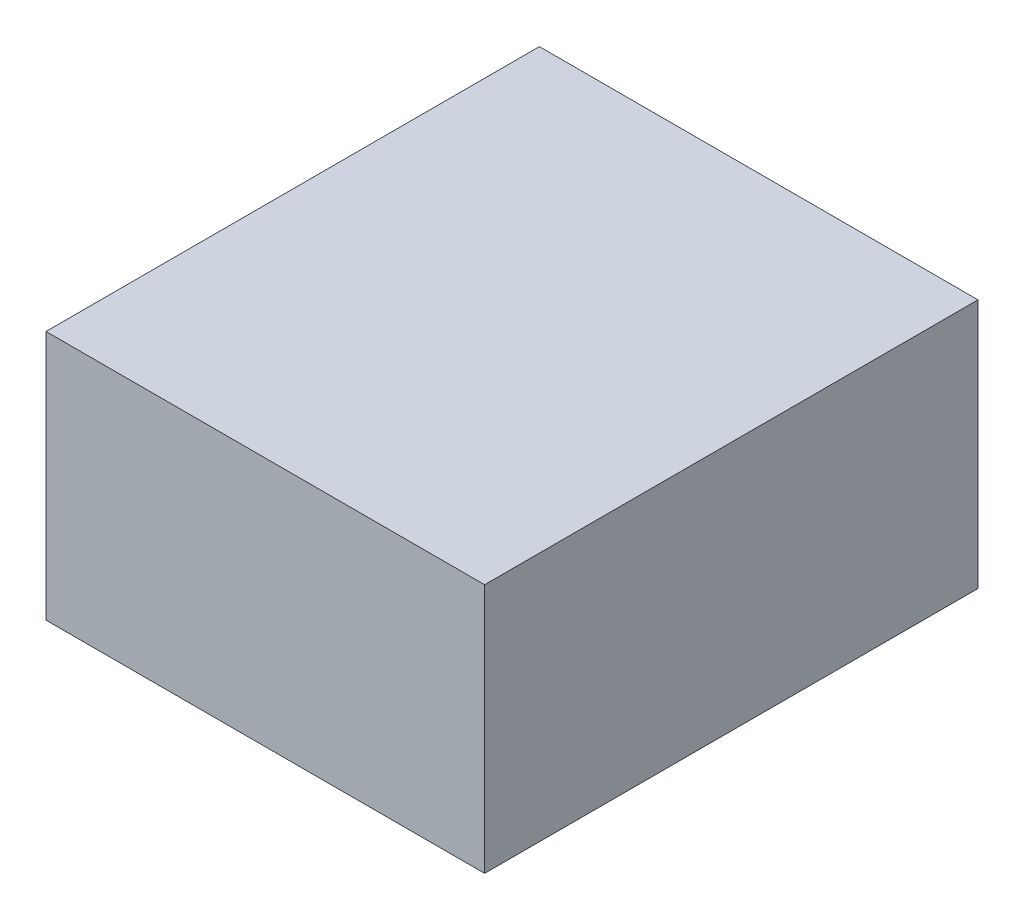
ISO-10303-21;
HEADER;
FILE_DESCRIPTION(('STEP AP214'),'2;1');
FILE_NAME('part.step','',(''),(''),'','','');
FILE_SCHEMA(('AUTOMOTIVE_DESIGN { 1 0 10303 214 1 1 1 1 }'));
ENDSEC;
DATA;
#1=APPLICATION_CONTEXT('core data for automotive mechanical design processes');
#2=APPLICATION_PROTOCOL_DEFINITION('international standard','automotive_design',2000,#1);
#3=PRODUCT_CONTEXT('',#1,'mechanical');
#4=PRODUCT('Part','Part','',(#3));
#5=PRODUCT_RELATED_PRODUCT_CATEGORY('part','',(#4));
#6=PRODUCT_DEFINITION_FORMATION('','',#4);
#7=PRODUCT_DEFINITION_CONTEXT('part definition',#1,'design');
#8=PRODUCT_DEFINITION('design','',#6,#7);
#9=PRODUCT_DEFINITION_SHAPE('','',#8);
#10=(LENGTH_UNIT() NAMED_UNIT(*) SI_UNIT(.MILLI.,.METRE.));
#11=(NAMED_UNIT(*) PLANE_ANGLE_UNIT() SI_UNIT($,.RADIAN.));
#12=(NAMED_UNIT(*) SI_UNIT($,.STERADIAN.) SOLID_ANGLE_UNIT());
#13=UNCERTAINTY_MEASURE_WITH_UNIT(LENGTH_MEASURE(1.E-05),#10,'distance_accuracy_value','');
#14=(GEOMETRIC_REPRESENTATION_CONTEXT(3) GLOBAL_UNCERTAINTY_ASSIGNED_CONTEXT((#13)) GLOBAL_UNIT_ASSIGNED_CONTEXT((#10,
#11,#12)) REPRESENTATION_CONTEXT('',''));
#15=CARTESIAN_POINT('',(0.,0.,0.));
#16=DIRECTION('',(0.,0.,1.));
#17=DIRECTION('',(1.,0.,0.));
#18=AXIS2_PLACEMENT_3D('',#15,#16,#17);
#19=CARTESIAN_POINT('',(0.04445,-0.025273,0.));
#20=DIRECTION('',(0.,-1.,0.));
#21=DIRECTION('',(0.,0.,-1.));
#22=AXIS2_PLACEMENT_3D('',#19,#20,#21);
#23=PLANE('',#22);
#24=DIRECTION('',(0.,0.,1.));
#25=VECTOR('',#24,1.);
#26=CARTESIAN_POINT('',(-0.04445,-0.025273,0.));
#27=LINE('',#26,#25);
#28=CARTESIAN_POINT('',(-0.04445,-0.025273,0.));
#29=VERTEX_POINT('',#28);
#30=CARTESIAN_POINT('',(-0.04445,-0.025273,0.1));
#31=VERTEX_POINT('',#30);
#32=EDGE_CURVE('E20',#29,#31,#27,.T.);
#33=ORIENTED_EDGE('',*,*,#32,.F.);
#34=DIRECTION('',(1.,0.,0.));
#35=VECTOR('',#34,1.);
#36=CARTESIAN_POINT('',(-0.04445,-0.025273,0.));
#37=LINE('',#36,#35);
#38=CARTESIAN_POINT('',(0.04445,-0.025273,0.));
#39=VERTEX_POINT('',#38);
#40=EDGE_CURVE('E80',#29,#39,#37,.T.);
#41=ORIENTED_EDGE('',*,*,#40,.T.);
#42=DIRECTION('',(0.,0.,-1.));
#43=VECTOR('',#42,1.);
#44=CARTESIAN_POINT('',(0.04445,-0.025273,0.));
#45=LINE('',#44,#43);
#46=CARTESIAN_POINT('',(0.04445,-0.025273,0.1));
#47=VERTEX_POINT('',#46);
#48=EDGE_CURVE('E68',#47,#39,#45,.T.);
#49=ORIENTED_EDGE('',*,*,#48,.F.);
#50=DIRECTION('',(1.,0.,0.));
#51=VECTOR('',#50,1.);
#52=CARTESIAN_POINT('',(-0.04445,-0.025273,0.1));
#53=LINE('',#52,#51);
#54=EDGE_CURVE('E56',#31,#47,#53,.T.);
#55=ORIENTED_EDGE('',*,*,#54,.F.);
#56=EDGE_LOOP('',(#33,#41,#49,#55));
#57=FACE_BOUND('',#56,.T.);
#58=ADVANCED_FACE('F17',(#57),#23,.T.);
#59=CARTESIAN_POINT('',(-0.04445,-0.025273,0.));
#60=DIRECTION('',(-1.,0.,0.));
#61=DIRECTION('',(0.,0.,1.));
#62=AXIS2_PLACEMENT_3D('',#59,#60,#61);
#63=PLANE('',#62);
#64=DIRECTION('',(0.,0.,1.));
#65=VECTOR('',#64,1.);
#66=CARTESIAN_POINT('',(-0.04445,0.0254,0.));
#67=LINE('',#66,#65);
#68=CARTESIAN_POINT('',(-0.04445,0.0254,0.));
#69=VERTEX_POINT('',#68);
#70=CARTESIAN_POINT('',(-0.04445,0.0254,0.1));
#71=VERTEX_POINT('',#70);
#72=EDGE_CURVE('E83',#69,#71,#67,.T.);
#73=ORIENTED_EDGE('',*,*,#72,.F.);
#74=DIRECTION('',(0.,1.,0.));
#75=VECTOR('',#74,1.);
#76=CARTESIAN_POINT('',(-0.04445,0.0254,0.));
#77=LINE('',#76,#75);
#78=EDGE_CURVE('E65',#69,#29,#77,.F.);
#79=ORIENTED_EDGE('',*,*,#78,.T.);
#80=ORIENTED_EDGE('',*,*,#32,.T.);
#81=DIRECTION('',(0.,1.,0.));
#82=VECTOR('',#81,1.);
#83=CARTESIAN_POINT('',(-0.04445,0.0254,0.1));
#84=LINE('',#83,#82);
#85=EDGE_CURVE('E62',#71,#31,#84,.F.);
#86=ORIENTED_EDGE('',*,*,#85,.F.);
#87=EDGE_LOOP('',(#73,#79,#80,#86));
#88=FACE_BOUND('',#87,.T.);
#89=ADVANCED_FACE('F61',(#88),#63,.T.);
#90=CARTESIAN_POINT('',(-0.04445,0.0254,0.1));
#91=DIRECTION('',(0.,0.,1.));
#92=DIRECTION('',(1.,0.,0.));
#93=AXIS2_PLACEMENT_3D('',#90,#91,#92);
#94=PLANE('',#93);
#95=DIRECTION('',(0.,1.,0.));
#96=VECTOR('',#95,1.);
#97=CARTESIAN_POINT('',(0.04445,0.0254,0.1));
#98=LINE('',#97,#96);
#99=CARTESIAN_POINT('',(0.04445,0.0254,0.1));
#100=VERTEX_POINT('',#99);
#101=EDGE_CURVE('E70',#100,#47,#98,.F.);
#102=ORIENTED_EDGE('',*,*,#101,.F.);
#103=DIRECTION('',(1.,0.,0.));
#104=VECTOR('',#103,1.);
#105=CARTESIAN_POINT('',(-0.04445,0.0254,0.1));
#106=LINE('',#105,#104);
#107=EDGE_CURVE('E74',#71,#100,#106,.T.);
#108=ORIENTED_EDGE('',*,*,#107,.F.);
#109=ORIENTED_EDGE('',*,*,#85,.T.);
#110=ORIENTED_EDGE('',*,*,#54,.T.);
#111=EDGE_LOOP('',(#102,#108,#109,#110));
#112=FACE_BOUND('',#111,.T.);
#113=ADVANCED_FACE('F72',(#112),#94,.T.);
#114=CARTESIAN_POINT('',(0.04445,0.0254,0.));
#115=DIRECTION('',(1.,0.,0.));
#116=DIRECTION('',(0.,0.,-1.));
#117=AXIS2_PLACEMENT_3D('',#114,#115,#116);
#118=PLANE('',#117);
#119=ORIENTED_EDGE('',*,*,#48,.T.);
#120=DIRECTION('',(0.,1.,0.));
#121=VECTOR('',#120,1.);
#122=CARTESIAN_POINT('',(0.04445,0.0254,0.));
#123=LINE('',#122,#121);
#124=CARTESIAN_POINT('',(0.04445,0.0254,0.));
#125=VERTEX_POINT('',#124);
#126=EDGE_CURVE('E35',#39,#125,#123,.T.);
#127=ORIENTED_EDGE('',*,*,#126,.T.);
#128=DIRECTION('',(0.,0.,1.));
#129=VECTOR('',#128,1.);
#130=CARTESIAN_POINT('',(0.04445,0.0254,0.));
#131=LINE('',#130,#129);
#132=EDGE_CURVE('E26',#100,#125,#131,.F.);
#133=ORIENTED_EDGE('',*,*,#132,.F.);
#134=ORIENTED_EDGE('',*,*,#101,.T.);
#135=EDGE_LOOP('',(#119,#127,#133,#134));
#136=FACE_BOUND('',#135,.T.);
#137=ADVANCED_FACE('F89',(#136),#118,.T.);
#138=CARTESIAN_POINT('',(-0.04445,0.0254,0.));
#139=DIRECTION('',(0.,0.,1.));
#140=DIRECTION('',(1.,0.,0.));
#141=AXIS2_PLACEMENT_3D('',#138,#139,#140);
#142=PLANE('',#141);
#143=ORIENTED_EDGE('',*,*,#126,.F.);
#144=ORIENTED_EDGE('',*,*,#40,.F.);
#145=ORIENTED_EDGE('',*,*,#78,.F.);
#146=DIRECTION('',(1.,0.,0.));
#147=VECTOR('',#146,1.);
#148=CARTESIAN_POINT('',(-0.04445,0.0254,0.));
#149=LINE('',#148,#147);
#150=EDGE_CURVE('E11',#125,#69,#149,.F.);
#151=ORIENTED_EDGE('',*,*,#150,.F.);
#152=EDGE_LOOP('',(#143,#144,#145,#151));
#153=FACE_BOUND('',#152,.T.);
#154=ADVANCED_FACE('F91',(#153),#142,.F.);
#155=CARTESIAN_POINT('',(-0.04445,0.0254,0.));
#156=DIRECTION('',(0.,1.,0.));
#157=DIRECTION('',(0.,0.,1.));
#158=AXIS2_PLACEMENT_3D('',#155,#156,#157);
#159=PLANE('',#158);
#160=ORIENTED_EDGE('',*,*,#132,.T.);
#161=ORIENTED_EDGE('',*,*,#150,.T.);
#162=ORIENTED_EDGE('',*,*,#72,.T.);
#163=ORIENTED_EDGE('',*,*,#107,.T.);
#164=EDGE_LOOP('',(#160,#161,#162,#163));
#165=FACE_BOUND('',#164,.T.);
#166=ADVANCED_FACE('F88',(#165),#159,.T.);
#167=CLOSED_SHELL('',(#58,#89,#113,#137,#154,#166));
#168=MANIFOLD_SOLID_BREP('B1',#167);
#169=ADVANCED_BREP_SHAPE_REPRESENTATION('',(#18,#168),#14);
#170=SHAPE_DEFINITION_REPRESENTATION(#9,#169);
ENDSEC;
END-ISO-10303-21;
